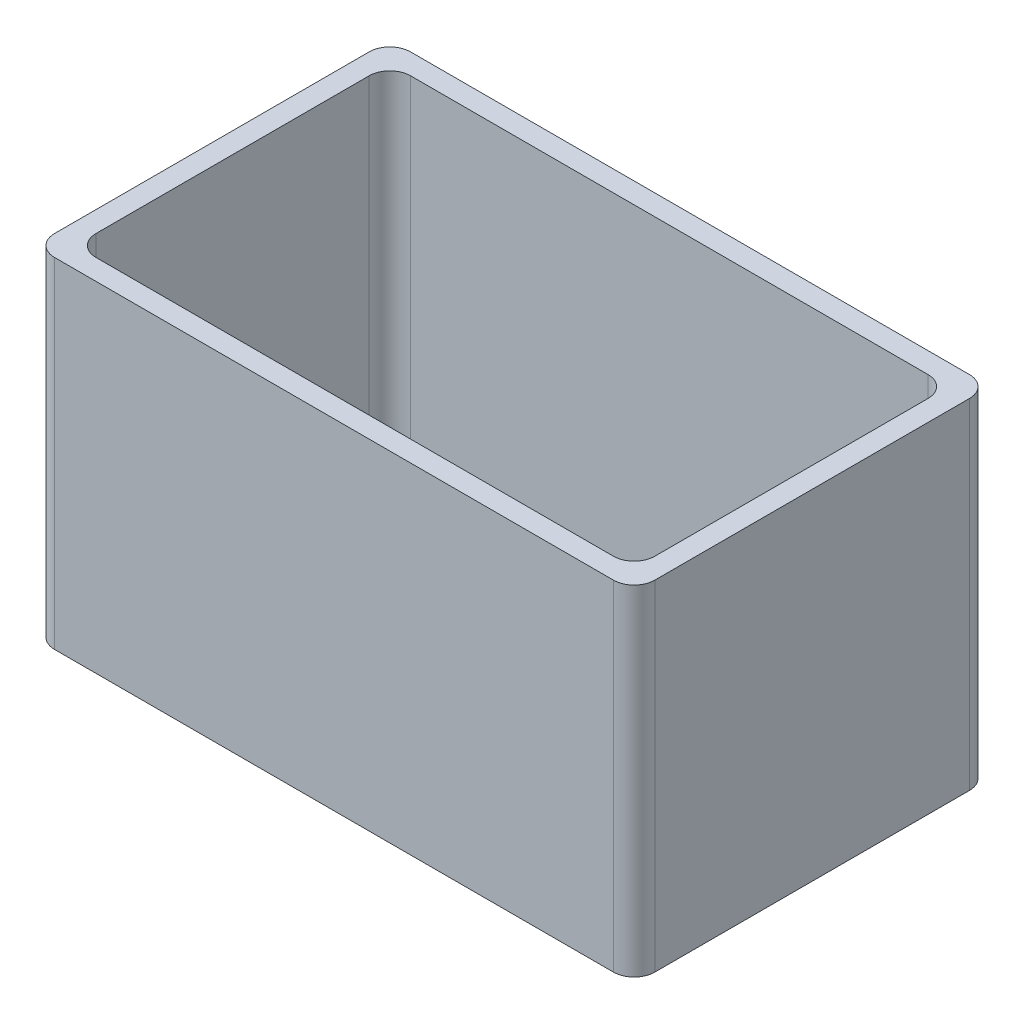
ISO-10303-21;
HEADER;
FILE_DESCRIPTION(('STEP AP214'),'2;1');
FILE_NAME('part.step','',(''),(''),'','','');
FILE_SCHEMA(('AUTOMOTIVE_DESIGN { 1 0 10303 214 1 1 1 1 }'));
ENDSEC;
DATA;
#1=APPLICATION_CONTEXT('core data for automotive mechanical design processes');
#2=APPLICATION_PROTOCOL_DEFINITION('international standard','automotive_design',2000,#1);
#3=PRODUCT_CONTEXT('',#1,'mechanical');
#4=PRODUCT('Part','Part','',(#3));
#5=PRODUCT_RELATED_PRODUCT_CATEGORY('part','',(#4));
#6=PRODUCT_DEFINITION_FORMATION('','',#4);
#7=PRODUCT_DEFINITION_CONTEXT('part definition',#1,'design');
#8=PRODUCT_DEFINITION('design','',#6,#7);
#9=PRODUCT_DEFINITION_SHAPE('','',#8);
#10=(LENGTH_UNIT() NAMED_UNIT(*) SI_UNIT(.MILLI.,.METRE.));
#11=(NAMED_UNIT(*) PLANE_ANGLE_UNIT() SI_UNIT($,.RADIAN.));
#12=(NAMED_UNIT(*) SI_UNIT($,.STERADIAN.) SOLID_ANGLE_UNIT());
#13=UNCERTAINTY_MEASURE_WITH_UNIT(LENGTH_MEASURE(1.E-05),#10,'distance_accuracy_value','');
#14=(GEOMETRIC_REPRESENTATION_CONTEXT(3) GLOBAL_UNCERTAINTY_ASSIGNED_CONTEXT((#13)) GLOBAL_UNIT_ASSIGNED_CONTEXT((#10,
#11,#12)) REPRESENTATION_CONTEXT('',''));
#15=CARTESIAN_POINT('',(0.,0.,0.));
#16=DIRECTION('',(0.,0.,1.));
#17=DIRECTION('',(1.,0.,0.));
#18=AXIS2_PLACEMENT_3D('',#15,#16,#17);
#19=CARTESIAN_POINT('',(-145.,82.,172.));
#20=DIRECTION('',(0.,-1.,0.));
#21=DIRECTION('',(0.,0.,-1.));
#22=AXIS2_PLACEMENT_3D('',#19,#20,#21);
#23=PLANE('',#22);
#24=DIRECTION('',(-1.,0.,0.));
#25=VECTOR('',#24,1.);
#26=CARTESIAN_POINT('',(-145.,82.,0.));
#27=LINE('',#26,#25);
#28=CARTESIAN_POINT('',(135.,82.,0.));
#29=VERTEX_POINT('',#28);
#30=CARTESIAN_POINT('',(-135.,82.,0.));
#31=VERTEX_POINT('',#30);
#32=EDGE_CURVE('E317',#29,#31,#27,.T.);
#33=ORIENTED_EDGE('',*,*,#32,.T.);
#34=CARTESIAN_POINT('',(-135.,82.,10.));
#35=DIRECTION('',(0.,-1.,0.));
#36=DIRECTION('',(0.,0.,-1.));
#37=AXIS2_PLACEMENT_3D('',#34,#35,#36);
#38=CIRCLE('',#37,10.);
#39=CARTESIAN_POINT('',(-145.,82.,10.));
#40=VERTEX_POINT('',#39);
#41=EDGE_CURVE('E211',#31,#40,#38,.F.);
#42=ORIENTED_EDGE('',*,*,#41,.T.);
#43=DIRECTION('',(0.,0.,-1.));
#44=VECTOR('',#43,1.);
#45=CARTESIAN_POINT('',(-145.,82.,172.));
#46=LINE('',#45,#44);
#47=CARTESIAN_POINT('',(-145.,82.,162.));
#48=VERTEX_POINT('',#47);
#49=EDGE_CURVE('E173',#48,#40,#46,.T.);
#50=ORIENTED_EDGE('',*,*,#49,.F.);
#51=CARTESIAN_POINT('',(-135.,82.,162.));
#52=DIRECTION('',(0.,-1.,0.));
#53=DIRECTION('',(0.,0.,-1.));
#54=AXIS2_PLACEMENT_3D('',#51,#52,#53);
#55=CIRCLE('',#54,10.);
#56=CARTESIAN_POINT('',(-135.,82.,172.));
#57=VERTEX_POINT('',#56);
#58=EDGE_CURVE('E178',#48,#57,#55,.F.);
#59=ORIENTED_EDGE('',*,*,#58,.T.);
#60=DIRECTION('',(-1.,0.,0.));
#61=VECTOR('',#60,1.);
#62=CARTESIAN_POINT('',(-145.,82.,172.));
#63=LINE('',#62,#61);
#64=CARTESIAN_POINT('',(135.,82.,172.));
#65=VERTEX_POINT('',#64);
#66=EDGE_CURVE('E323',#65,#57,#63,.T.);
#67=ORIENTED_EDGE('',*,*,#66,.F.);
#68=CARTESIAN_POINT('',(135.,82.,162.));
#69=DIRECTION('',(0.,-1.,0.));
#70=DIRECTION('',(0.,0.,-1.));
#71=AXIS2_PLACEMENT_3D('',#68,#69,#70);
#72=CIRCLE('',#71,10.);
#73=CARTESIAN_POINT('',(145.,82.,162.));
#74=VERTEX_POINT('',#73);
#75=EDGE_CURVE('E205',#65,#74,#72,.F.);
#76=ORIENTED_EDGE('',*,*,#75,.T.);
#77=DIRECTION('',(0.,0.,-1.));
#78=VECTOR('',#77,1.);
#79=CARTESIAN_POINT('',(145.,82.,172.));
#80=LINE('',#79,#78);
#81=CARTESIAN_POINT('',(145.,82.,10.));
#82=VERTEX_POINT('',#81);
#83=EDGE_CURVE('E180',#74,#82,#80,.T.);
#84=ORIENTED_EDGE('',*,*,#83,.T.);
#85=CARTESIAN_POINT('',(135.,82.,10.));
#86=DIRECTION('',(0.,-1.,0.));
#87=DIRECTION('',(0.,0.,-1.));
#88=AXIS2_PLACEMENT_3D('',#85,#86,#87);
#89=CIRCLE('',#88,10.);
#90=EDGE_CURVE('E208',#82,#29,#89,.F.);
#91=ORIENTED_EDGE('',*,*,#90,.T.);
#92=EDGE_LOOP('',(#33,#42,#50,#59,#67,#76,#84,#91));
#93=FACE_BOUND('',#92,.T.);
#94=DIRECTION('',(-1.,0.,0.));
#95=VECTOR('',#94,1.);
#96=CARTESIAN_POINT('',(0.,82.,10.));
#97=LINE('',#96,#95);
#98=CARTESIAN_POINT('',(125.,82.,10.));
#99=VERTEX_POINT('',#98);
#100=CARTESIAN_POINT('',(-125.,82.,10.));
#101=VERTEX_POINT('',#100);
#102=EDGE_CURVE('E313',#99,#101,#97,.T.);
#103=ORIENTED_EDGE('',*,*,#102,.F.);
#104=CARTESIAN_POINT('',(125.,82.,20.));
#105=DIRECTION('',(0.,-1.,0.));
#106=DIRECTION('',(0.,0.,-1.));
#107=AXIS2_PLACEMENT_3D('',#104,#105,#106);
#108=CIRCLE('',#107,10.);
#109=CARTESIAN_POINT('',(135.,82.,20.));
#110=VERTEX_POINT('',#109);
#111=EDGE_CURVE('E267',#99,#110,#108,.T.);
#112=ORIENTED_EDGE('',*,*,#111,.T.);
#113=DIRECTION('',(0.,0.,-1.));
#114=VECTOR('',#113,1.);
#115=CARTESIAN_POINT('',(135.,82.,172.));
#116=LINE('',#115,#114);
#117=CARTESIAN_POINT('',(135.,82.,152.));
#118=VERTEX_POINT('',#117);
#119=EDGE_CURVE('E279',#118,#110,#116,.T.);
#120=ORIENTED_EDGE('',*,*,#119,.F.);
#121=CARTESIAN_POINT('',(125.,82.,152.));
#122=DIRECTION('',(0.,-1.,0.));
#123=DIRECTION('',(0.,0.,-1.));
#124=AXIS2_PLACEMENT_3D('',#121,#122,#123);
#125=CIRCLE('',#124,10.);
#126=CARTESIAN_POINT('',(125.,82.,162.));
#127=VERTEX_POINT('',#126);
#128=EDGE_CURVE('E270',#118,#127,#125,.T.);
#129=ORIENTED_EDGE('',*,*,#128,.T.);
#130=DIRECTION('',(-1.,0.,0.));
#131=VECTOR('',#130,1.);
#132=CARTESIAN_POINT('',(0.,82.,162.));
#133=LINE('',#132,#131);
#134=CARTESIAN_POINT('',(-125.,82.,162.));
#135=VERTEX_POINT('',#134);
#136=EDGE_CURVE('E277',#127,#135,#133,.T.);
#137=ORIENTED_EDGE('',*,*,#136,.T.);
#138=CARTESIAN_POINT('',(-125.,82.,152.));
#139=DIRECTION('',(0.,-1.,0.));
#140=DIRECTION('',(0.,0.,-1.));
#141=AXIS2_PLACEMENT_3D('',#138,#139,#140);
#142=CIRCLE('',#141,10.);
#143=CARTESIAN_POINT('',(-135.,82.,152.));
#144=VERTEX_POINT('',#143);
#145=EDGE_CURVE('E47',#135,#144,#142,.T.);
#146=ORIENTED_EDGE('',*,*,#145,.T.);
#147=DIRECTION('',(0.,0.,-1.));
#148=VECTOR('',#147,1.);
#149=CARTESIAN_POINT('',(-135.,82.,172.));
#150=LINE('',#149,#148);
#151=CARTESIAN_POINT('',(-135.,82.,20.));
#152=VERTEX_POINT('',#151);
#153=EDGE_CURVE('E307',#144,#152,#150,.T.);
#154=ORIENTED_EDGE('',*,*,#153,.T.);
#155=CARTESIAN_POINT('',(-125.,82.,20.));
#156=DIRECTION('',(0.,-1.,0.));
#157=DIRECTION('',(0.,0.,-1.));
#158=AXIS2_PLACEMENT_3D('',#155,#156,#157);
#159=CIRCLE('',#158,10.);
#160=EDGE_CURVE('E11',#152,#101,#159,.T.);
#161=ORIENTED_EDGE('',*,*,#160,.T.);
#162=EDGE_LOOP('',(#103,#112,#120,#129,#137,#146,#154,#161));
#163=FACE_BOUND('',#162,.T.);
#164=ADVANCED_FACE('F38',(#93,#163),#23,.F.);
#165=CARTESIAN_POINT('',(145.,-82.,172.));
#166=DIRECTION('',(-1.,0.,0.));
#167=DIRECTION('',(0.,0.,1.));
#168=AXIS2_PLACEMENT_3D('',#165,#166,#167);
#169=PLANE('',#168);
#170=DIRECTION('',(0.,0.,-1.));
#171=VECTOR('',#170,1.);
#172=CARTESIAN_POINT('',(145.,-82.,172.));
#173=LINE('',#172,#171);
#174=CARTESIAN_POINT('',(145.,-82.,162.));
#175=VERTEX_POINT('',#174);
#176=CARTESIAN_POINT('',(145.,-82.,10.));
#177=VERTEX_POINT('',#176);
#178=EDGE_CURVE('E174',#175,#177,#173,.T.);
#179=ORIENTED_EDGE('',*,*,#178,.T.);
#180=DIRECTION('',(0.,1.,0.));
#181=VECTOR('',#180,1.);
#182=CARTESIAN_POINT('',(145.,82.,10.));
#183=LINE('',#182,#181);
#184=EDGE_CURVE('E217',#177,#82,#183,.T.);
#185=ORIENTED_EDGE('',*,*,#184,.T.);
#186=ORIENTED_EDGE('',*,*,#83,.F.);
#187=DIRECTION('',(0.,1.,0.));
#188=VECTOR('',#187,1.);
#189=CARTESIAN_POINT('',(145.,-82.,162.));
#190=LINE('',#189,#188);
#191=EDGE_CURVE('E214',#74,#175,#190,.F.);
#192=ORIENTED_EDGE('',*,*,#191,.T.);
#193=EDGE_LOOP('',(#179,#185,#186,#192));
#194=FACE_BOUND('',#193,.T.);
#195=ADVANCED_FACE('F356',(#194),#169,.F.);
#196=CARTESIAN_POINT('',(-145.,-82.,172.));
#197=DIRECTION('',(1.,0.,0.));
#198=DIRECTION('',(0.,0.,-1.));
#199=AXIS2_PLACEMENT_3D('',#196,#197,#198);
#200=PLANE('',#199);
#201=ORIENTED_EDGE('',*,*,#49,.T.);
#202=DIRECTION('',(0.,-1.,0.));
#203=VECTOR('',#202,1.);
#204=CARTESIAN_POINT('',(-145.,-82.,10.));
#205=LINE('',#204,#203);
#206=CARTESIAN_POINT('',(-145.,-82.,10.));
#207=VERTEX_POINT('',#206);
#208=EDGE_CURVE('E163',#40,#207,#205,.T.);
#209=ORIENTED_EDGE('',*,*,#208,.T.);
#210=DIRECTION('',(0.,0.,-1.));
#211=VECTOR('',#210,1.);
#212=CARTESIAN_POINT('',(-145.,-82.,172.));
#213=LINE('',#212,#211);
#214=CARTESIAN_POINT('',(-145.,-82.,162.));
#215=VERTEX_POINT('',#214);
#216=EDGE_CURVE('E154',#215,#207,#213,.T.);
#217=ORIENTED_EDGE('',*,*,#216,.F.);
#218=DIRECTION('',(0.,-1.,0.));
#219=VECTOR('',#218,1.);
#220=CARTESIAN_POINT('',(-145.,-82.,162.));
#221=LINE('',#220,#219);
#222=EDGE_CURVE('E169',#215,#48,#221,.F.);
#223=ORIENTED_EDGE('',*,*,#222,.T.);
#224=EDGE_LOOP('',(#201,#209,#217,#223));
#225=FACE_BOUND('',#224,.T.);
#226=ADVANCED_FACE('F168',(#225),#200,.F.);
#227=CARTESIAN_POINT('',(-145.,-82.,172.));
#228=DIRECTION('',(0.,1.,0.));
#229=DIRECTION('',(0.,0.,1.));
#230=AXIS2_PLACEMENT_3D('',#227,#228,#229);
#231=PLANE('',#230);
#232=ORIENTED_EDGE('',*,*,#216,.T.);
#233=CARTESIAN_POINT('',(-135.,-82.,10.));
#234=DIRECTION('',(0.,1.,0.));
#235=DIRECTION('',(0.,0.,1.));
#236=AXIS2_PLACEMENT_3D('',#233,#234,#235);
#237=CIRCLE('',#236,10.);
#238=CARTESIAN_POINT('',(-135.,-82.,0.));
#239=VERTEX_POINT('',#238);
#240=EDGE_CURVE('E194',#207,#239,#237,.F.);
#241=ORIENTED_EDGE('',*,*,#240,.T.);
#242=DIRECTION('',(1.,0.,0.));
#243=VECTOR('',#242,1.);
#244=CARTESIAN_POINT('',(-145.,-82.,0.));
#245=LINE('',#244,#243);
#246=CARTESIAN_POINT('',(135.,-82.,0.));
#247=VERTEX_POINT('',#246);
#248=EDGE_CURVE('E327',#239,#247,#245,.T.);
#249=ORIENTED_EDGE('',*,*,#248,.T.);
#250=CARTESIAN_POINT('',(135.,-82.,10.));
#251=DIRECTION('',(0.,1.,0.));
#252=DIRECTION('',(0.,0.,1.));
#253=AXIS2_PLACEMENT_3D('',#250,#251,#252);
#254=CIRCLE('',#253,10.);
#255=EDGE_CURVE('E191',#247,#177,#254,.F.);
#256=ORIENTED_EDGE('',*,*,#255,.T.);
#257=ORIENTED_EDGE('',*,*,#178,.F.);
#258=CARTESIAN_POINT('',(135.,-82.,162.));
#259=DIRECTION('',(0.,1.,0.));
#260=DIRECTION('',(0.,0.,1.));
#261=AXIS2_PLACEMENT_3D('',#258,#259,#260);
#262=CIRCLE('',#261,10.);
#263=CARTESIAN_POINT('',(135.,-82.,172.));
#264=VERTEX_POINT('',#263);
#265=EDGE_CURVE('E162',#175,#264,#262,.F.);
#266=ORIENTED_EDGE('',*,*,#265,.T.);
#267=DIRECTION('',(1.,0.,0.));
#268=VECTOR('',#267,1.);
#269=CARTESIAN_POINT('',(-145.,-82.,172.));
#270=LINE('',#269,#268);
#271=CARTESIAN_POINT('',(-135.,-82.,172.));
#272=VERTEX_POINT('',#271);
#273=EDGE_CURVE('E156',#272,#264,#270,.T.);
#274=ORIENTED_EDGE('',*,*,#273,.F.);
#275=CARTESIAN_POINT('',(-135.,-82.,162.));
#276=DIRECTION('',(0.,1.,0.));
#277=DIRECTION('',(0.,0.,1.));
#278=AXIS2_PLACEMENT_3D('',#275,#276,#277);
#279=CIRCLE('',#278,10.);
#280=EDGE_CURVE('E151',#272,#215,#279,.F.);
#281=ORIENTED_EDGE('',*,*,#280,.T.);
#282=EDGE_LOOP('',(#232,#241,#249,#256,#257,#266,#274,#281));
#283=FACE_BOUND('',#282,.T.);
#284=ADVANCED_FACE('F153',(#283),#231,.F.);
#285=CARTESIAN_POINT('',(0.,0.,172.));
#286=DIRECTION('',(0.,0.,-1.));
#287=DIRECTION('',(-1.,0.,0.));
#288=AXIS2_PLACEMENT_3D('',#285,#286,#287);
#289=PLANE('',#288);
#290=ORIENTED_EDGE('',*,*,#273,.T.);
#291=DIRECTION('',(0.,1.,0.));
#292=VECTOR('',#291,1.);
#293=CARTESIAN_POINT('',(135.,0.,172.));
#294=LINE('',#293,#292);
#295=EDGE_CURVE('E224',#264,#65,#294,.T.);
#296=ORIENTED_EDGE('',*,*,#295,.T.);
#297=ORIENTED_EDGE('',*,*,#66,.T.);
#298=DIRECTION('',(0.,-1.,0.));
#299=VECTOR('',#298,1.);
#300=CARTESIAN_POINT('',(-135.,0.,172.));
#301=LINE('',#300,#299);
#302=EDGE_CURVE('E221',#57,#272,#301,.T.);
#303=ORIENTED_EDGE('',*,*,#302,.T.);
#304=EDGE_LOOP('',(#290,#296,#297,#303));
#305=FACE_BOUND('',#304,.T.);
#306=ADVANCED_FACE('F363',(#305),#289,.F.);
#307=CARTESIAN_POINT('',(0.,0.,0.));
#308=DIRECTION('',(0.,0.,-1.));
#309=DIRECTION('',(-1.,0.,0.));
#310=AXIS2_PLACEMENT_3D('',#307,#308,#309);
#311=PLANE('',#310);
#312=ORIENTED_EDGE('',*,*,#248,.F.);
#313=DIRECTION('',(0.,-1.,0.));
#314=VECTOR('',#313,1.);
#315=CARTESIAN_POINT('',(-135.,82.,0.));
#316=LINE('',#315,#314);
#317=EDGE_CURVE('E200',#239,#31,#316,.F.);
#318=ORIENTED_EDGE('',*,*,#317,.T.);
#319=ORIENTED_EDGE('',*,*,#32,.F.);
#320=DIRECTION('',(0.,1.,0.));
#321=VECTOR('',#320,1.);
#322=CARTESIAN_POINT('',(135.,-82.,0.));
#323=LINE('',#322,#321);
#324=EDGE_CURVE('E197',#29,#247,#323,.F.);
#325=ORIENTED_EDGE('',*,*,#324,.T.);
#326=EDGE_LOOP('',(#312,#318,#319,#325));
#327=FACE_BOUND('',#326,.T.);
#328=ADVANCED_FACE('F347',(#327),#311,.T.);
#329=CARTESIAN_POINT('',(-135.,-82.,10.));
#330=DIRECTION('',(0.,1.,0.));
#331=DIRECTION('',(0.,0.,1.));
#332=AXIS2_PLACEMENT_3D('',#329,#330,#331);
#333=CYLINDRICAL_SURFACE('',#332,10.);
#334=ORIENTED_EDGE('',*,*,#41,.F.);
#335=ORIENTED_EDGE('',*,*,#317,.F.);
#336=ORIENTED_EDGE('',*,*,#240,.F.);
#337=ORIENTED_EDGE('',*,*,#208,.F.);
#338=EDGE_LOOP('',(#334,#335,#336,#337));
#339=FACE_BOUND('',#338,.T.);
#340=ADVANCED_FACE('F342',(#339),#333,.T.);
#341=CARTESIAN_POINT('',(135.,-82.,10.));
#342=DIRECTION('',(0.,-1.,0.));
#343=DIRECTION('',(0.,0.,-1.));
#344=AXIS2_PLACEMENT_3D('',#341,#342,#343);
#345=CYLINDRICAL_SURFACE('',#344,10.);
#346=ORIENTED_EDGE('',*,*,#255,.F.);
#347=ORIENTED_EDGE('',*,*,#324,.F.);
#348=ORIENTED_EDGE('',*,*,#90,.F.);
#349=ORIENTED_EDGE('',*,*,#184,.F.);
#350=EDGE_LOOP('',(#346,#347,#348,#349));
#351=FACE_BOUND('',#350,.T.);
#352=ADVANCED_FACE('F351',(#351),#345,.T.);
#353=CARTESIAN_POINT('',(135.,0.,162.));
#354=DIRECTION('',(0.,1.,0.));
#355=DIRECTION('',(0.,0.,1.));
#356=AXIS2_PLACEMENT_3D('',#353,#354,#355);
#357=CYLINDRICAL_SURFACE('',#356,10.);
#358=ORIENTED_EDGE('',*,*,#265,.F.);
#359=ORIENTED_EDGE('',*,*,#191,.F.);
#360=ORIENTED_EDGE('',*,*,#75,.F.);
#361=ORIENTED_EDGE('',*,*,#295,.F.);
#362=EDGE_LOOP('',(#358,#359,#360,#361));
#363=FACE_BOUND('',#362,.T.);
#364=ADVANCED_FACE('F360',(#363),#357,.T.);
#365=CARTESIAN_POINT('',(-135.,0.,162.));
#366=DIRECTION('',(0.,-1.,0.));
#367=DIRECTION('',(0.,0.,-1.));
#368=AXIS2_PLACEMENT_3D('',#365,#366,#367);
#369=CYLINDRICAL_SURFACE('',#368,10.);
#370=ORIENTED_EDGE('',*,*,#58,.F.);
#371=ORIENTED_EDGE('',*,*,#222,.F.);
#372=ORIENTED_EDGE('',*,*,#280,.F.);
#373=ORIENTED_EDGE('',*,*,#302,.F.);
#374=EDGE_LOOP('',(#370,#371,#372,#373));
#375=FACE_BOUND('',#374,.T.);
#376=ADVANCED_FACE('F177',(#375),#369,.T.);
#377=CARTESIAN_POINT('',(135.,-82.,172.));
#378=DIRECTION('',(-1.,0.,0.));
#379=DIRECTION('',(0.,0.,1.));
#380=AXIS2_PLACEMENT_3D('',#377,#378,#379);
#381=PLANE('',#380);
#382=ORIENTED_EDGE('',*,*,#119,.T.);
#383=DIRECTION('',(0.,-1.,0.));
#384=VECTOR('',#383,1.);
#385=CARTESIAN_POINT('',(135.,-82.,20.));
#386=LINE('',#385,#384);
#387=CARTESIAN_POINT('',(135.,-72.,20.));
#388=VERTEX_POINT('',#387);
#389=EDGE_CURVE('E231',#110,#388,#386,.T.);
#390=ORIENTED_EDGE('',*,*,#389,.T.);
#391=DIRECTION('',(0.,0.,-1.));
#392=VECTOR('',#391,1.);
#393=CARTESIAN_POINT('',(135.,-72.,172.));
#394=LINE('',#393,#392);
#395=CARTESIAN_POINT('',(135.,-72.,152.));
#396=VERTEX_POINT('',#395);
#397=EDGE_CURVE('E297',#396,#388,#394,.T.);
#398=ORIENTED_EDGE('',*,*,#397,.F.);
#399=DIRECTION('',(0.,-1.,0.));
#400=VECTOR('',#399,1.);
#401=CARTESIAN_POINT('',(135.,82.,152.));
#402=LINE('',#401,#400);
#403=EDGE_CURVE('E228',#396,#118,#402,.F.);
#404=ORIENTED_EDGE('',*,*,#403,.T.);
#405=EDGE_LOOP('',(#382,#390,#398,#404));
#406=FACE_BOUND('',#405,.T.);
#407=ADVANCED_FACE('F299',(#406),#381,.T.);
#408=CARTESIAN_POINT('',(-135.,-82.,172.));
#409=DIRECTION('',(1.,0.,0.));
#410=DIRECTION('',(0.,0.,-1.));
#411=AXIS2_PLACEMENT_3D('',#408,#409,#410);
#412=PLANE('',#411);
#413=ORIENTED_EDGE('',*,*,#153,.F.);
#414=DIRECTION('',(0.,1.,0.));
#415=VECTOR('',#414,1.);
#416=CARTESIAN_POINT('',(-135.,-72.,152.));
#417=LINE('',#416,#415);
#418=CARTESIAN_POINT('',(-135.,-72.,152.));
#419=VERTEX_POINT('',#418);
#420=EDGE_CURVE('E264',#144,#419,#417,.F.);
#421=ORIENTED_EDGE('',*,*,#420,.T.);
#422=DIRECTION('',(0.,0.,-1.));
#423=VECTOR('',#422,1.);
#424=CARTESIAN_POINT('',(-135.,-72.,172.));
#425=LINE('',#424,#423);
#426=CARTESIAN_POINT('',(-135.,-72.,20.));
#427=VERTEX_POINT('',#426);
#428=EDGE_CURVE('E302',#419,#427,#425,.T.);
#429=ORIENTED_EDGE('',*,*,#428,.T.);
#430=DIRECTION('',(0.,1.,0.));
#431=VECTOR('',#430,1.);
#432=CARTESIAN_POINT('',(-135.,-82.,20.));
#433=LINE('',#432,#431);
#434=EDGE_CURVE('E261',#427,#152,#433,.T.);
#435=ORIENTED_EDGE('',*,*,#434,.T.);
#436=EDGE_LOOP('',(#413,#421,#429,#435));
#437=FACE_BOUND('',#436,.T.);
#438=ADVANCED_FACE('F402',(#437),#412,.T.);
#439=CARTESIAN_POINT('',(-145.,-72.,172.));
#440=DIRECTION('',(0.,1.,0.));
#441=DIRECTION('',(0.,0.,1.));
#442=AXIS2_PLACEMENT_3D('',#439,#440,#441);
#443=PLANE('',#442);
#444=ORIENTED_EDGE('',*,*,#397,.T.);
#445=CARTESIAN_POINT('',(125.,-72.,20.));
#446=DIRECTION('',(0.,1.,0.));
#447=DIRECTION('',(0.,0.,1.));
#448=AXIS2_PLACEMENT_3D('',#445,#446,#447);
#449=CIRCLE('',#448,10.);
#450=CARTESIAN_POINT('',(125.,-72.,10.));
#451=VERTEX_POINT('',#450);
#452=EDGE_CURVE('E244',#388,#451,#449,.T.);
#453=ORIENTED_EDGE('',*,*,#452,.T.);
#454=DIRECTION('',(1.,0.,0.));
#455=VECTOR('',#454,1.);
#456=CARTESIAN_POINT('',(0.,-72.,10.));
#457=LINE('',#456,#455);
#458=CARTESIAN_POINT('',(-125.,-72.,10.));
#459=VERTEX_POINT('',#458);
#460=EDGE_CURVE('E290',#459,#451,#457,.T.);
#461=ORIENTED_EDGE('',*,*,#460,.F.);
#462=CARTESIAN_POINT('',(-125.,-72.,20.));
#463=DIRECTION('',(0.,1.,0.));
#464=DIRECTION('',(0.,0.,1.));
#465=AXIS2_PLACEMENT_3D('',#462,#463,#464);
#466=CIRCLE('',#465,10.);
#467=EDGE_CURVE('E235',#459,#427,#466,.T.);
#468=ORIENTED_EDGE('',*,*,#467,.T.);
#469=ORIENTED_EDGE('',*,*,#428,.F.);
#470=CARTESIAN_POINT('',(-125.,-72.,152.));
#471=DIRECTION('',(0.,1.,0.));
#472=DIRECTION('',(0.,0.,1.));
#473=AXIS2_PLACEMENT_3D('',#470,#471,#472);
#474=CIRCLE('',#473,10.);
#475=CARTESIAN_POINT('',(-125.,-72.,162.));
#476=VERTEX_POINT('',#475);
#477=EDGE_CURVE('E238',#419,#476,#474,.T.);
#478=ORIENTED_EDGE('',*,*,#477,.T.);
#479=DIRECTION('',(1.,0.,0.));
#480=VECTOR('',#479,1.);
#481=CARTESIAN_POINT('',(0.,-72.,162.));
#482=LINE('',#481,#480);
#483=CARTESIAN_POINT('',(125.,-72.,162.));
#484=VERTEX_POINT('',#483);
#485=EDGE_CURVE('E289',#476,#484,#482,.T.);
#486=ORIENTED_EDGE('',*,*,#485,.T.);
#487=CARTESIAN_POINT('',(125.,-72.,152.));
#488=DIRECTION('',(0.,1.,0.));
#489=DIRECTION('',(0.,0.,1.));
#490=AXIS2_PLACEMENT_3D('',#487,#488,#489);
#491=CIRCLE('',#490,10.);
#492=EDGE_CURVE('E241',#484,#396,#491,.T.);
#493=ORIENTED_EDGE('',*,*,#492,.T.);
#494=EDGE_LOOP('',(#444,#453,#461,#468,#469,#478,#486,#493));
#495=FACE_BOUND('',#494,.T.);
#496=ADVANCED_FACE('F296',(#495),#443,.T.);
#497=CARTESIAN_POINT('',(0.,0.,162.));
#498=DIRECTION('',(0.,0.,-1.));
#499=DIRECTION('',(-1.,0.,0.));
#500=AXIS2_PLACEMENT_3D('',#497,#498,#499);
#501=PLANE('',#500);
#502=ORIENTED_EDGE('',*,*,#136,.F.);
#503=DIRECTION('',(0.,-1.,0.));
#504=VECTOR('',#503,1.);
#505=CARTESIAN_POINT('',(125.,-72.,162.));
#506=LINE('',#505,#504);
#507=EDGE_CURVE('E257',#127,#484,#506,.T.);
#508=ORIENTED_EDGE('',*,*,#507,.T.);
#509=ORIENTED_EDGE('',*,*,#485,.F.);
#510=DIRECTION('',(0.,1.,0.));
#511=VECTOR('',#510,1.);
#512=CARTESIAN_POINT('',(-125.,82.,162.));
#513=LINE('',#512,#511);
#514=EDGE_CURVE('E253',#476,#135,#513,.T.);
#515=ORIENTED_EDGE('',*,*,#514,.T.);
#516=EDGE_LOOP('',(#502,#508,#509,#515));
#517=FACE_BOUND('',#516,.T.);
#518=ADVANCED_FACE('F284',(#517),#501,.T.);
#519=CARTESIAN_POINT('',(0.,0.,10.));
#520=DIRECTION('',(0.,0.,-1.));
#521=DIRECTION('',(-1.,0.,0.));
#522=AXIS2_PLACEMENT_3D('',#519,#520,#521);
#523=PLANE('',#522);
#524=ORIENTED_EDGE('',*,*,#460,.T.);
#525=DIRECTION('',(0.,-1.,0.));
#526=VECTOR('',#525,1.);
#527=CARTESIAN_POINT('',(125.,0.,10.));
#528=LINE('',#527,#526);
#529=EDGE_CURVE('E250',#451,#99,#528,.F.);
#530=ORIENTED_EDGE('',*,*,#529,.T.);
#531=ORIENTED_EDGE('',*,*,#102,.T.);
#532=DIRECTION('',(0.,1.,0.));
#533=VECTOR('',#532,1.);
#534=CARTESIAN_POINT('',(-125.,0.,10.));
#535=LINE('',#534,#533);
#536=EDGE_CURVE('E247',#101,#459,#535,.F.);
#537=ORIENTED_EDGE('',*,*,#536,.T.);
#538=EDGE_LOOP('',(#524,#530,#531,#537));
#539=FACE_BOUND('',#538,.T.);
#540=ADVANCED_FACE('F387',(#539),#523,.F.);
#541=CARTESIAN_POINT('',(125.,-82.,20.));
#542=DIRECTION('',(0.,-1.,0.));
#543=DIRECTION('',(0.,0.,-1.));
#544=AXIS2_PLACEMENT_3D('',#541,#542,#543);
#545=CYLINDRICAL_SURFACE('',#544,10.);
#546=ORIENTED_EDGE('',*,*,#111,.F.);
#547=ORIENTED_EDGE('',*,*,#529,.F.);
#548=ORIENTED_EDGE('',*,*,#452,.F.);
#549=ORIENTED_EDGE('',*,*,#389,.F.);
#550=EDGE_LOOP('',(#546,#547,#548,#549));
#551=FACE_BOUND('',#550,.T.);
#552=ADVANCED_FACE('F384',(#551),#545,.F.);
#553=CARTESIAN_POINT('',(125.,0.,152.));
#554=DIRECTION('',(0.,1.,0.));
#555=DIRECTION('',(0.,0.,1.));
#556=AXIS2_PLACEMENT_3D('',#553,#554,#555);
#557=CYLINDRICAL_SURFACE('',#556,10.);
#558=ORIENTED_EDGE('',*,*,#128,.F.);
#559=ORIENTED_EDGE('',*,*,#403,.F.);
#560=ORIENTED_EDGE('',*,*,#492,.F.);
#561=ORIENTED_EDGE('',*,*,#507,.F.);
#562=EDGE_LOOP('',(#558,#559,#560,#561));
#563=FACE_BOUND('',#562,.T.);
#564=ADVANCED_FACE('F292',(#563),#557,.F.);
#565=CARTESIAN_POINT('',(-125.,0.,152.));
#566=DIRECTION('',(0.,-1.,0.));
#567=DIRECTION('',(0.,0.,-1.));
#568=AXIS2_PLACEMENT_3D('',#565,#566,#567);
#569=CYLINDRICAL_SURFACE('',#568,10.);
#570=ORIENTED_EDGE('',*,*,#477,.F.);
#571=ORIENTED_EDGE('',*,*,#420,.F.);
#572=ORIENTED_EDGE('',*,*,#145,.F.);
#573=ORIENTED_EDGE('',*,*,#514,.F.);
#574=EDGE_LOOP('',(#570,#571,#572,#573));
#575=FACE_BOUND('',#574,.T.);
#576=ADVANCED_FACE('F390',(#575),#569,.F.);
#577=CARTESIAN_POINT('',(-125.,-82.,20.));
#578=DIRECTION('',(0.,1.,0.));
#579=DIRECTION('',(0.,0.,1.));
#580=AXIS2_PLACEMENT_3D('',#577,#578,#579);
#581=CYLINDRICAL_SURFACE('',#580,10.);
#582=ORIENTED_EDGE('',*,*,#467,.F.);
#583=ORIENTED_EDGE('',*,*,#536,.F.);
#584=ORIENTED_EDGE('',*,*,#160,.F.);
#585=ORIENTED_EDGE('',*,*,#434,.F.);
#586=EDGE_LOOP('',(#582,#583,#584,#585));
#587=FACE_BOUND('',#586,.T.);
#588=ADVANCED_FACE('F40',(#587),#581,.F.);
#589=CLOSED_SHELL('',(#164,#195,#226,#284,#306,#328,#340,#352,#364,#376,#407,#438,#496,#518,
#540,#552,#564,#576,#588));
#590=MANIFOLD_SOLID_BREP('B2',#589);
#591=ADVANCED_BREP_SHAPE_REPRESENTATION('',(#18,#590),#14);
#592=SHAPE_DEFINITION_REPRESENTATION(#9,#591);
ENDSEC;
END-ISO-10303-21;
